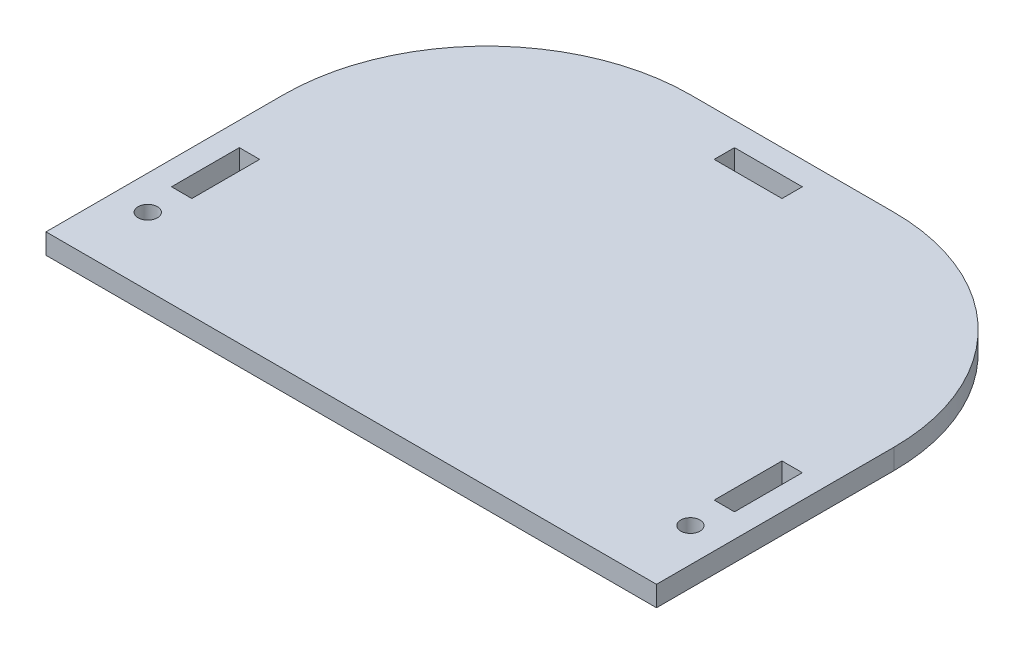
ISO-10303-21;
HEADER;
FILE_DESCRIPTION(('STEP AP214'),'2;1');
FILE_NAME('part.step','',(''),(''),'','','');
FILE_SCHEMA(('AUTOMOTIVE_DESIGN { 1 0 10303 214 1 1 1 1 }'));
ENDSEC;
DATA;
#1=APPLICATION_CONTEXT('core data for automotive mechanical design processes');
#2=APPLICATION_PROTOCOL_DEFINITION('international standard','automotive_design',2000,#1);
#3=PRODUCT_CONTEXT('',#1,'mechanical');
#4=PRODUCT('Part','Part','',(#3));
#5=PRODUCT_RELATED_PRODUCT_CATEGORY('part','',(#4));
#6=PRODUCT_DEFINITION_FORMATION('','',#4);
#7=PRODUCT_DEFINITION_CONTEXT('part definition',#1,'design');
#8=PRODUCT_DEFINITION('design','',#6,#7);
#9=PRODUCT_DEFINITION_SHAPE('','',#8);
#10=(LENGTH_UNIT() NAMED_UNIT(*) SI_UNIT(.MILLI.,.METRE.));
#11=(NAMED_UNIT(*) PLANE_ANGLE_UNIT() SI_UNIT($,.RADIAN.));
#12=(NAMED_UNIT(*) SI_UNIT($,.STERADIAN.) SOLID_ANGLE_UNIT());
#13=UNCERTAINTY_MEASURE_WITH_UNIT(LENGTH_MEASURE(1.E-05),#10,'distance_accuracy_value','');
#14=(GEOMETRIC_REPRESENTATION_CONTEXT(3) GLOBAL_UNCERTAINTY_ASSIGNED_CONTEXT((#13)) GLOBAL_UNIT_ASSIGNED_CONTEXT((#10,
#11,#12)) REPRESENTATION_CONTEXT('',''));
#15=CARTESIAN_POINT('',(0.,0.,0.));
#16=DIRECTION('',(0.,0.,1.));
#17=DIRECTION('',(1.,0.,0.));
#18=AXIS2_PLACEMENT_3D('',#15,#16,#17);
#19=CARTESIAN_POINT('',(0.,3.,0.));
#20=DIRECTION('',(0.,1.,0.));
#21=DIRECTION('',(0.,0.,1.));
#22=AXIS2_PLACEMENT_3D('',#19,#20,#21);
#23=PLANE('',#22);
#24=CARTESIAN_POINT('',(-40.,3.,-5.));
#25=DIRECTION('',(0.,1.,0.));
#26=DIRECTION('',(0.,0.,1.));
#27=AXIS2_PLACEMENT_3D('',#24,#25,#26);
#28=CIRCLE('',#27,1.425);
#29=CARTESIAN_POINT('',(-40.,3.,-3.575));
#30=VERTEX_POINT('',#29);
#31=EDGE_CURVE('E195',#30,#30,#28,.T.);
#32=ORIENTED_EDGE('',*,*,#31,.F.);
#33=EDGE_LOOP('',(#32));
#34=FACE_BOUND('',#33,.T.);
#35=DIRECTION('',(0.,0.,-1.));
#36=VECTOR('',#35,1.);
#37=CARTESIAN_POINT('',(45.,3.,-60.));
#38=LINE('',#37,#36);
#39=CARTESIAN_POINT('',(45.,3.,5.));
#40=VERTEX_POINT('',#39);
#41=CARTESIAN_POINT('',(45.,3.,-30.));
#42=VERTEX_POINT('',#41);
#43=EDGE_CURVE('E273',#40,#42,#38,.T.);
#44=ORIENTED_EDGE('',*,*,#43,.T.);
#45=CARTESIAN_POINT('',(15.,3.,-30.));
#46=DIRECTION('',(0.,1.,0.));
#47=DIRECTION('',(0.,0.,1.));
#48=AXIS2_PLACEMENT_3D('',#45,#46,#47);
#49=CIRCLE('',#48,30.);
#50=CARTESIAN_POINT('',(15.,3.,-60.));
#51=VERTEX_POINT('',#50);
#52=EDGE_CURVE('E41',#42,#51,#49,.T.);
#53=ORIENTED_EDGE('',*,*,#52,.T.);
#54=DIRECTION('',(-1.,0.,0.));
#55=VECTOR('',#54,1.);
#56=CARTESIAN_POINT('',(-45.,3.,-60.));
#57=LINE('',#56,#55);
#58=CARTESIAN_POINT('',(-15.,3.,-60.));
#59=VERTEX_POINT('',#58);
#60=EDGE_CURVE('E275',#51,#59,#57,.T.);
#61=ORIENTED_EDGE('',*,*,#60,.T.);
#62=CARTESIAN_POINT('',(-15.,3.,-30.));
#63=DIRECTION('',(0.,1.,0.));
#64=DIRECTION('',(0.,0.,1.));
#65=AXIS2_PLACEMENT_3D('',#62,#63,#64);
#66=CIRCLE('',#65,30.);
#67=CARTESIAN_POINT('',(-45.,3.,-30.));
#68=VERTEX_POINT('',#67);
#69=EDGE_CURVE('E48',#59,#68,#66,.T.);
#70=ORIENTED_EDGE('',*,*,#69,.T.);
#71=DIRECTION('',(0.,0.,1.));
#72=VECTOR('',#71,1.);
#73=CARTESIAN_POINT('',(-45.,3.,-60.));
#74=LINE('',#73,#72);
#75=CARTESIAN_POINT('',(-45.,3.,5.));
#76=VERTEX_POINT('',#75);
#77=EDGE_CURVE('E268',#68,#76,#74,.T.);
#78=ORIENTED_EDGE('',*,*,#77,.T.);
#79=DIRECTION('',(1.,0.,0.));
#80=VECTOR('',#79,1.);
#81=CARTESIAN_POINT('',(-45.,3.,5.));
#82=LINE('',#81,#80);
#83=EDGE_CURVE('E270',#76,#40,#82,.T.);
#84=ORIENTED_EDGE('',*,*,#83,.T.);
#85=EDGE_LOOP('',(#44,#53,#61,#70,#78,#84));
#86=FACE_BOUND('',#85,.T.);
#87=DIRECTION('',(1.,0.,0.));
#88=VECTOR('',#87,1.);
#89=CARTESIAN_POINT('',(-5.,3.,-53.5));
#90=LINE('',#89,#88);
#91=CARTESIAN_POINT('',(-5.,3.,-53.5));
#92=VERTEX_POINT('',#91);
#93=CARTESIAN_POINT('',(5.,3.,-53.5));
#94=VERTEX_POINT('',#93);
#95=EDGE_CURVE('E239',#92,#94,#90,.T.);
#96=ORIENTED_EDGE('',*,*,#95,.F.);
#97=DIRECTION('',(0.,0.,1.));
#98=VECTOR('',#97,1.);
#99=CARTESIAN_POINT('',(-5.,3.,-56.5));
#100=LINE('',#99,#98);
#101=CARTESIAN_POINT('',(-5.,3.,-56.5));
#102=VERTEX_POINT('',#101);
#103=EDGE_CURVE('E237',#102,#92,#100,.T.);
#104=ORIENTED_EDGE('',*,*,#103,.F.);
#105=DIRECTION('',(-1.,0.,0.));
#106=VECTOR('',#105,1.);
#107=CARTESIAN_POINT('',(-5.,3.,-56.5));
#108=LINE('',#107,#106);
#109=CARTESIAN_POINT('',(5.,3.,-56.5));
#110=VERTEX_POINT('',#109);
#111=EDGE_CURVE('E245',#110,#102,#108,.T.);
#112=ORIENTED_EDGE('',*,*,#111,.F.);
#113=DIRECTION('',(0.,0.,-1.));
#114=VECTOR('',#113,1.);
#115=CARTESIAN_POINT('',(5.,3.,-56.5));
#116=LINE('',#115,#114);
#117=EDGE_CURVE('E242',#94,#110,#116,.T.);
#118=ORIENTED_EDGE('',*,*,#117,.F.);
#119=EDGE_LOOP('',(#96,#104,#112,#118));
#120=FACE_BOUND('',#119,.T.);
#121=DIRECTION('',(1.,0.,0.));
#122=VECTOR('',#121,1.);
#123=CARTESIAN_POINT('',(-41.5,3.,-10.));
#124=LINE('',#123,#122);
#125=CARTESIAN_POINT('',(-41.5,3.,-10.));
#126=VERTEX_POINT('',#125);
#127=CARTESIAN_POINT('',(-38.5,3.,-10.));
#128=VERTEX_POINT('',#127);
#129=EDGE_CURVE('E208',#126,#128,#124,.T.);
#130=ORIENTED_EDGE('',*,*,#129,.F.);
#131=DIRECTION('',(0.,0.,1.));
#132=VECTOR('',#131,1.);
#133=CARTESIAN_POINT('',(-41.5,3.,-20.));
#134=LINE('',#133,#132);
#135=CARTESIAN_POINT('',(-41.5,3.,-20.));
#136=VERTEX_POINT('',#135);
#137=EDGE_CURVE('E206',#136,#126,#134,.T.);
#138=ORIENTED_EDGE('',*,*,#137,.F.);
#139=DIRECTION('',(-1.,0.,0.));
#140=VECTOR('',#139,1.);
#141=CARTESIAN_POINT('',(-41.5,3.,-20.));
#142=LINE('',#141,#140);
#143=CARTESIAN_POINT('',(-38.5,3.,-20.));
#144=VERTEX_POINT('',#143);
#145=EDGE_CURVE('E214',#144,#136,#142,.T.);
#146=ORIENTED_EDGE('',*,*,#145,.F.);
#147=DIRECTION('',(0.,0.,-1.));
#148=VECTOR('',#147,1.);
#149=CARTESIAN_POINT('',(-38.5,3.,-20.));
#150=LINE('',#149,#148);
#151=EDGE_CURVE('E211',#128,#144,#150,.T.);
#152=ORIENTED_EDGE('',*,*,#151,.F.);
#153=EDGE_LOOP('',(#130,#138,#146,#152));
#154=FACE_BOUND('',#153,.T.);
#155=DIRECTION('',(1.,0.,0.));
#156=VECTOR('',#155,1.);
#157=CARTESIAN_POINT('',(38.5,3.,-10.0000000000001));
#158=LINE('',#157,#156);
#159=CARTESIAN_POINT('',(38.5,3.,-10.0000000000001));
#160=VERTEX_POINT('',#159);
#161=CARTESIAN_POINT('',(41.5,3.,-10.0000000000001));
#162=VERTEX_POINT('',#161);
#163=EDGE_CURVE('E172',#160,#162,#158,.T.);
#164=ORIENTED_EDGE('',*,*,#163,.F.);
#165=DIRECTION('',(0.,0.,1.));
#166=VECTOR('',#165,1.);
#167=CARTESIAN_POINT('',(38.5,3.,-20.0000000000001));
#168=LINE('',#167,#166);
#169=CARTESIAN_POINT('',(38.5,3.,-20.0000000000001));
#170=VERTEX_POINT('',#169);
#171=EDGE_CURVE('E162',#170,#160,#168,.T.);
#172=ORIENTED_EDGE('',*,*,#171,.F.);
#173=DIRECTION('',(-1.,0.,0.));
#174=VECTOR('',#173,1.);
#175=CARTESIAN_POINT('',(38.5,3.,-20.0000000000001));
#176=LINE('',#175,#174);
#177=CARTESIAN_POINT('',(41.5,3.,-20.0000000000001));
#178=VERTEX_POINT('',#177);
#179=EDGE_CURVE('E188',#178,#170,#176,.T.);
#180=ORIENTED_EDGE('',*,*,#179,.F.);
#181=DIRECTION('',(0.,0.,-1.));
#182=VECTOR('',#181,1.);
#183=CARTESIAN_POINT('',(41.5,3.,-20.0000000000001));
#184=LINE('',#183,#182);
#185=EDGE_CURVE('E186',#162,#178,#184,.T.);
#186=ORIENTED_EDGE('',*,*,#185,.F.);
#187=EDGE_LOOP('',(#164,#172,#180,#186));
#188=FACE_BOUND('',#187,.T.);
#189=CARTESIAN_POINT('',(40.,3.,-5.));
#190=DIRECTION('',(0.,1.,0.));
#191=DIRECTION('',(0.,0.,1.));
#192=AXIS2_PLACEMENT_3D('',#189,#190,#191);
#193=CIRCLE('',#192,1.425);
#194=CARTESIAN_POINT('',(40.,3.,-3.575));
#195=VERTEX_POINT('',#194);
#196=EDGE_CURVE('E530',#195,#195,#193,.T.);
#197=ORIENTED_EDGE('',*,*,#196,.F.);
#198=EDGE_LOOP('',(#197));
#199=FACE_BOUND('',#198,.T.);
#200=ADVANCED_FACE('F33',(#34,#86,#120,#154,#188,#199),#23,.T.);
#201=CARTESIAN_POINT('',(0.,0.,0.));
#202=DIRECTION('',(0.,1.,0.));
#203=DIRECTION('',(0.,0.,1.));
#204=AXIS2_PLACEMENT_3D('',#201,#202,#203);
#205=PLANE('',#204);
#206=DIRECTION('',(0.,0.,1.));
#207=VECTOR('',#206,1.);
#208=CARTESIAN_POINT('',(-41.5,0.,-20.));
#209=LINE('',#208,#207);
#210=CARTESIAN_POINT('',(-41.5,0.,-20.));
#211=VERTEX_POINT('',#210);
#212=CARTESIAN_POINT('',(-41.5,0.,-10.));
#213=VERTEX_POINT('',#212);
#214=EDGE_CURVE('E180',#211,#213,#209,.T.);
#215=ORIENTED_EDGE('',*,*,#214,.T.);
#216=DIRECTION('',(1.,0.,0.));
#217=VECTOR('',#216,1.);
#218=CARTESIAN_POINT('',(-41.5,0.,-10.));
#219=LINE('',#218,#217);
#220=CARTESIAN_POINT('',(-38.5,0.,-10.));
#221=VERTEX_POINT('',#220);
#222=EDGE_CURVE('E219',#213,#221,#219,.T.);
#223=ORIENTED_EDGE('',*,*,#222,.T.);
#224=DIRECTION('',(0.,0.,-1.));
#225=VECTOR('',#224,1.);
#226=CARTESIAN_POINT('',(-38.5,0.,-20.));
#227=LINE('',#226,#225);
#228=CARTESIAN_POINT('',(-38.5,0.,-20.));
#229=VERTEX_POINT('',#228);
#230=EDGE_CURVE('E222',#221,#229,#227,.T.);
#231=ORIENTED_EDGE('',*,*,#230,.T.);
#232=DIRECTION('',(-1.,0.,0.));
#233=VECTOR('',#232,1.);
#234=CARTESIAN_POINT('',(-41.5,0.,-20.));
#235=LINE('',#234,#233);
#236=EDGE_CURVE('E209',#229,#211,#235,.T.);
#237=ORIENTED_EDGE('',*,*,#236,.T.);
#238=EDGE_LOOP('',(#215,#223,#231,#237));
#239=FACE_BOUND('',#238,.T.);
#240=DIRECTION('',(-1.,0.,0.));
#241=VECTOR('',#240,1.);
#242=CARTESIAN_POINT('',(-45.,0.,-60.));
#243=LINE('',#242,#241);
#244=CARTESIAN_POINT('',(15.,0.,-60.));
#245=VERTEX_POINT('',#244);
#246=CARTESIAN_POINT('',(-15.,0.,-60.));
#247=VERTEX_POINT('',#246);
#248=EDGE_CURVE('E271',#245,#247,#243,.T.);
#249=ORIENTED_EDGE('',*,*,#248,.F.);
#250=CARTESIAN_POINT('',(15.,0.,-30.));
#251=DIRECTION('',(0.,1.,0.));
#252=DIRECTION('',(0.,0.,1.));
#253=AXIS2_PLACEMENT_3D('',#250,#251,#252);
#254=CIRCLE('',#253,30.);
#255=CARTESIAN_POINT('',(45.,0.,-30.));
#256=VERTEX_POINT('',#255);
#257=EDGE_CURVE('E297',#245,#256,#254,.F.);
#258=ORIENTED_EDGE('',*,*,#257,.T.);
#259=DIRECTION('',(0.,0.,-1.));
#260=VECTOR('',#259,1.);
#261=CARTESIAN_POINT('',(45.,0.,-60.));
#262=LINE('',#261,#260);
#263=CARTESIAN_POINT('',(45.,0.,5.));
#264=VERTEX_POINT('',#263);
#265=EDGE_CURVE('E281',#264,#256,#262,.T.);
#266=ORIENTED_EDGE('',*,*,#265,.F.);
#267=DIRECTION('',(1.,0.,0.));
#268=VECTOR('',#267,1.);
#269=CARTESIAN_POINT('',(-45.,0.,5.));
#270=LINE('',#269,#268);
#271=CARTESIAN_POINT('',(-45.,0.,5.));
#272=VERTEX_POINT('',#271);
#273=EDGE_CURVE('E279',#272,#264,#270,.T.);
#274=ORIENTED_EDGE('',*,*,#273,.F.);
#275=DIRECTION('',(0.,0.,1.));
#276=VECTOR('',#275,1.);
#277=CARTESIAN_POINT('',(-45.,0.,-60.));
#278=LINE('',#277,#276);
#279=CARTESIAN_POINT('',(-45.,0.,-30.));
#280=VERTEX_POINT('',#279);
#281=EDGE_CURVE('E267',#280,#272,#278,.T.);
#282=ORIENTED_EDGE('',*,*,#281,.F.);
#283=CARTESIAN_POINT('',(-15.,0.,-30.));
#284=DIRECTION('',(0.,1.,0.));
#285=DIRECTION('',(0.,0.,1.));
#286=AXIS2_PLACEMENT_3D('',#283,#284,#285);
#287=CIRCLE('',#286,30.);
#288=EDGE_CURVE('E295',#280,#247,#287,.F.);
#289=ORIENTED_EDGE('',*,*,#288,.T.);
#290=EDGE_LOOP('',(#249,#258,#266,#274,#282,#289));
#291=FACE_BOUND('',#290,.T.);
#292=DIRECTION('',(0.,0.,1.));
#293=VECTOR('',#292,1.);
#294=CARTESIAN_POINT('',(-5.,0.,-56.5));
#295=LINE('',#294,#293);
#296=CARTESIAN_POINT('',(-5.,0.,-56.5));
#297=VERTEX_POINT('',#296);
#298=CARTESIAN_POINT('',(-5.,0.,-53.5));
#299=VERTEX_POINT('',#298);
#300=EDGE_CURVE('E236',#297,#299,#295,.T.);
#301=ORIENTED_EDGE('',*,*,#300,.T.);
#302=DIRECTION('',(1.,0.,0.));
#303=VECTOR('',#302,1.);
#304=CARTESIAN_POINT('',(-5.,0.,-53.5));
#305=LINE('',#304,#303);
#306=CARTESIAN_POINT('',(5.,0.,-53.5));
#307=VERTEX_POINT('',#306);
#308=EDGE_CURVE('E250',#299,#307,#305,.T.);
#309=ORIENTED_EDGE('',*,*,#308,.T.);
#310=DIRECTION('',(0.,0.,-1.));
#311=VECTOR('',#310,1.);
#312=CARTESIAN_POINT('',(5.,0.,-56.5));
#313=LINE('',#312,#311);
#314=CARTESIAN_POINT('',(5.,0.,-56.5));
#315=VERTEX_POINT('',#314);
#316=EDGE_CURVE('E253',#307,#315,#313,.T.);
#317=ORIENTED_EDGE('',*,*,#316,.T.);
#318=DIRECTION('',(-1.,0.,0.));
#319=VECTOR('',#318,1.);
#320=CARTESIAN_POINT('',(-5.,0.,-56.5));
#321=LINE('',#320,#319);
#322=EDGE_CURVE('E240',#315,#297,#321,.T.);
#323=ORIENTED_EDGE('',*,*,#322,.T.);
#324=EDGE_LOOP('',(#301,#309,#317,#323));
#325=FACE_BOUND('',#324,.T.);
#326=DIRECTION('',(0.,0.,1.));
#327=VECTOR('',#326,1.);
#328=CARTESIAN_POINT('',(38.5,0.,-20.0000000000001));
#329=LINE('',#328,#327);
#330=CARTESIAN_POINT('',(38.5,0.,-20.0000000000001));
#331=VERTEX_POINT('',#330);
#332=CARTESIAN_POINT('',(38.5,0.,-10.0000000000001));
#333=VERTEX_POINT('',#332);
#334=EDGE_CURVE('E193',#331,#333,#329,.T.);
#335=ORIENTED_EDGE('',*,*,#334,.T.);
#336=DIRECTION('',(1.,0.,0.));
#337=VECTOR('',#336,1.);
#338=CARTESIAN_POINT('',(38.5,0.,-10.0000000000001));
#339=LINE('',#338,#337);
#340=CARTESIAN_POINT('',(41.5,0.,-10.0000000000001));
#341=VERTEX_POINT('',#340);
#342=EDGE_CURVE('E179',#333,#341,#339,.T.);
#343=ORIENTED_EDGE('',*,*,#342,.T.);
#344=DIRECTION('',(0.,0.,-1.));
#345=VECTOR('',#344,1.);
#346=CARTESIAN_POINT('',(41.5,0.,-20.0000000000001));
#347=LINE('',#346,#345);
#348=CARTESIAN_POINT('',(41.5,0.,-20.0000000000001));
#349=VERTEX_POINT('',#348);
#350=EDGE_CURVE('E197',#341,#349,#347,.T.);
#351=ORIENTED_EDGE('',*,*,#350,.T.);
#352=DIRECTION('',(-1.,0.,0.));
#353=VECTOR('',#352,1.);
#354=CARTESIAN_POINT('',(38.5,0.,-20.0000000000001));
#355=LINE('',#354,#353);
#356=EDGE_CURVE('E173',#349,#331,#355,.T.);
#357=ORIENTED_EDGE('',*,*,#356,.T.);
#358=EDGE_LOOP('',(#335,#343,#351,#357));
#359=FACE_BOUND('',#358,.T.);
#360=CARTESIAN_POINT('',(-40.,0.,-5.));
#361=DIRECTION('',(0.,1.,0.));
#362=DIRECTION('',(0.,0.,1.));
#363=AXIS2_PLACEMENT_3D('',#360,#361,#362);
#364=CIRCLE('',#363,1.425);
#365=CARTESIAN_POINT('',(-40.,0.,-3.575));
#366=VERTEX_POINT('',#365);
#367=EDGE_CURVE('E536',#366,#366,#364,.T.);
#368=ORIENTED_EDGE('',*,*,#367,.T.);
#369=EDGE_LOOP('',(#368));
#370=FACE_BOUND('',#369,.T.);
#371=CARTESIAN_POINT('',(40.,0.,-5.));
#372=DIRECTION('',(0.,1.,0.));
#373=DIRECTION('',(0.,0.,1.));
#374=AXIS2_PLACEMENT_3D('',#371,#372,#373);
#375=CIRCLE('',#374,1.425);
#376=CARTESIAN_POINT('',(40.,0.,-3.575));
#377=VERTEX_POINT('',#376);
#378=EDGE_CURVE('E533',#377,#377,#375,.T.);
#379=ORIENTED_EDGE('',*,*,#378,.T.);
#380=EDGE_LOOP('',(#379));
#381=FACE_BOUND('',#380,.T.);
#382=ADVANCED_FACE('F312',(#239,#291,#325,#359,#370,#381),#205,.F.);
#383=CARTESIAN_POINT('',(-45.,3.,-60.));
#384=DIRECTION('',(1.,0.,0.));
#385=DIRECTION('',(0.,0.,-1.));
#386=AXIS2_PLACEMENT_3D('',#383,#384,#385);
#387=PLANE('',#386);
#388=ORIENTED_EDGE('',*,*,#77,.F.);
#389=DIRECTION('',(0.,-1.,0.));
#390=VECTOR('',#389,1.);
#391=CARTESIAN_POINT('',(-45.,3.,-30.));
#392=LINE('',#391,#390);
#393=EDGE_CURVE('E11',#68,#280,#392,.T.);
#394=ORIENTED_EDGE('',*,*,#393,.T.);
#395=ORIENTED_EDGE('',*,*,#281,.T.);
#396=DIRECTION('',(0.,-1.,0.));
#397=VECTOR('',#396,1.);
#398=CARTESIAN_POINT('',(-45.,3.,5.));
#399=LINE('',#398,#397);
#400=EDGE_CURVE('E287',#76,#272,#399,.T.);
#401=ORIENTED_EDGE('',*,*,#400,.F.);
#402=EDGE_LOOP('',(#388,#394,#395,#401));
#403=FACE_BOUND('',#402,.T.);
#404=ADVANCED_FACE('F323',(#403),#387,.F.);
#405=CARTESIAN_POINT('',(-45.,3.,5.));
#406=DIRECTION('',(0.,0.,-1.));
#407=DIRECTION('',(-1.,0.,0.));
#408=AXIS2_PLACEMENT_3D('',#405,#406,#407);
#409=PLANE('',#408);
#410=ORIENTED_EDGE('',*,*,#273,.T.);
#411=DIRECTION('',(0.,-1.,0.));
#412=VECTOR('',#411,1.);
#413=CARTESIAN_POINT('',(45.,3.,5.));
#414=LINE('',#413,#412);
#415=EDGE_CURVE('E277',#40,#264,#414,.T.);
#416=ORIENTED_EDGE('',*,*,#415,.F.);
#417=ORIENTED_EDGE('',*,*,#83,.F.);
#418=ORIENTED_EDGE('',*,*,#400,.T.);
#419=EDGE_LOOP('',(#410,#416,#417,#418));
#420=FACE_BOUND('',#419,.T.);
#421=ADVANCED_FACE('F319',(#420),#409,.F.);
#422=CARTESIAN_POINT('',(45.,3.,-60.));
#423=DIRECTION('',(-1.,0.,0.));
#424=DIRECTION('',(0.,0.,1.));
#425=AXIS2_PLACEMENT_3D('',#422,#423,#424);
#426=PLANE('',#425);
#427=ORIENTED_EDGE('',*,*,#265,.T.);
#428=DIRECTION('',(0.,-1.,0.));
#429=VECTOR('',#428,1.);
#430=CARTESIAN_POINT('',(45.,3.,-30.));
#431=LINE('',#430,#429);
#432=EDGE_CURVE('E56',#256,#42,#431,.F.);
#433=ORIENTED_EDGE('',*,*,#432,.T.);
#434=ORIENTED_EDGE('',*,*,#43,.F.);
#435=ORIENTED_EDGE('',*,*,#415,.T.);
#436=EDGE_LOOP('',(#427,#433,#434,#435));
#437=FACE_BOUND('',#436,.T.);
#438=ADVANCED_FACE('F315',(#437),#426,.F.);
#439=CARTESIAN_POINT('',(-45.,3.,-60.));
#440=DIRECTION('',(0.,0.,1.));
#441=DIRECTION('',(1.,0.,0.));
#442=AXIS2_PLACEMENT_3D('',#439,#440,#441);
#443=PLANE('',#442);
#444=ORIENTED_EDGE('',*,*,#60,.F.);
#445=DIRECTION('',(0.,-1.,0.));
#446=VECTOR('',#445,1.);
#447=CARTESIAN_POINT('',(15.,3.,-60.));
#448=LINE('',#447,#446);
#449=EDGE_CURVE('E292',#51,#245,#448,.T.);
#450=ORIENTED_EDGE('',*,*,#449,.T.);
#451=ORIENTED_EDGE('',*,*,#248,.T.);
#452=DIRECTION('',(0.,-1.,0.));
#453=VECTOR('',#452,1.);
#454=CARTESIAN_POINT('',(-15.,3.,-60.));
#455=LINE('',#454,#453);
#456=EDGE_CURVE('E290',#247,#59,#455,.F.);
#457=ORIENTED_EDGE('',*,*,#456,.T.);
#458=EDGE_LOOP('',(#444,#450,#451,#457));
#459=FACE_BOUND('',#458,.T.);
#460=ADVANCED_FACE('F306',(#459),#443,.F.);
#461=CARTESIAN_POINT('',(-5.,3.,-56.5));
#462=DIRECTION('',(1.,0.,0.));
#463=DIRECTION('',(0.,0.,-1.));
#464=AXIS2_PLACEMENT_3D('',#461,#462,#463);
#465=PLANE('',#464);
#466=ORIENTED_EDGE('',*,*,#300,.F.);
#467=DIRECTION('',(0.,-1.,0.));
#468=VECTOR('',#467,1.);
#469=CARTESIAN_POINT('',(-5.,3.,-56.5));
#470=LINE('',#469,#468);
#471=EDGE_CURVE('E247',#102,#297,#470,.T.);
#472=ORIENTED_EDGE('',*,*,#471,.F.);
#473=ORIENTED_EDGE('',*,*,#103,.T.);
#474=DIRECTION('',(0.,-1.,0.));
#475=VECTOR('',#474,1.);
#476=CARTESIAN_POINT('',(-5.,3.,-53.5));
#477=LINE('',#476,#475);
#478=EDGE_CURVE('E264',#92,#299,#477,.T.);
#479=ORIENTED_EDGE('',*,*,#478,.T.);
#480=EDGE_LOOP('',(#466,#472,#473,#479));
#481=FACE_BOUND('',#480,.T.);
#482=ADVANCED_FACE('F341',(#481),#465,.T.);
#483=CARTESIAN_POINT('',(-5.,3.,-53.5));
#484=DIRECTION('',(0.,0.,-1.));
#485=DIRECTION('',(-1.,0.,0.));
#486=AXIS2_PLACEMENT_3D('',#483,#484,#485);
#487=PLANE('',#486);
#488=ORIENTED_EDGE('',*,*,#308,.F.);
#489=ORIENTED_EDGE('',*,*,#478,.F.);
#490=ORIENTED_EDGE('',*,*,#95,.T.);
#491=DIRECTION('',(0.,-1.,0.));
#492=VECTOR('',#491,1.);
#493=CARTESIAN_POINT('',(5.,3.,-53.5));
#494=LINE('',#493,#492);
#495=EDGE_CURVE('E262',#94,#307,#494,.T.);
#496=ORIENTED_EDGE('',*,*,#495,.T.);
#497=EDGE_LOOP('',(#488,#489,#490,#496));
#498=FACE_BOUND('',#497,.T.);
#499=ADVANCED_FACE('F374',(#498),#487,.T.);
#500=CARTESIAN_POINT('',(5.,3.,-56.5));
#501=DIRECTION('',(-1.,0.,0.));
#502=DIRECTION('',(0.,0.,1.));
#503=AXIS2_PLACEMENT_3D('',#500,#501,#502);
#504=PLANE('',#503);
#505=ORIENTED_EDGE('',*,*,#316,.F.);
#506=ORIENTED_EDGE('',*,*,#495,.F.);
#507=ORIENTED_EDGE('',*,*,#117,.T.);
#508=DIRECTION('',(0.,-1.,0.));
#509=VECTOR('',#508,1.);
#510=CARTESIAN_POINT('',(5.,3.,-56.5));
#511=LINE('',#510,#509);
#512=EDGE_CURVE('E260',#110,#315,#511,.T.);
#513=ORIENTED_EDGE('',*,*,#512,.T.);
#514=EDGE_LOOP('',(#505,#506,#507,#513));
#515=FACE_BOUND('',#514,.T.);
#516=ADVANCED_FACE('F381',(#515),#504,.T.);
#517=CARTESIAN_POINT('',(-5.,3.,-56.5));
#518=DIRECTION('',(0.,0.,1.));
#519=DIRECTION('',(1.,0.,0.));
#520=AXIS2_PLACEMENT_3D('',#517,#518,#519);
#521=PLANE('',#520);
#522=ORIENTED_EDGE('',*,*,#322,.F.);
#523=ORIENTED_EDGE('',*,*,#512,.F.);
#524=ORIENTED_EDGE('',*,*,#111,.T.);
#525=ORIENTED_EDGE('',*,*,#471,.T.);
#526=EDGE_LOOP('',(#522,#523,#524,#525));
#527=FACE_BOUND('',#526,.T.);
#528=ADVANCED_FACE('F388',(#527),#521,.T.);
#529=CARTESIAN_POINT('',(-41.5,3.,-20.));
#530=DIRECTION('',(1.,0.,0.));
#531=DIRECTION('',(0.,0.,-1.));
#532=AXIS2_PLACEMENT_3D('',#529,#530,#531);
#533=PLANE('',#532);
#534=ORIENTED_EDGE('',*,*,#214,.F.);
#535=DIRECTION('',(0.,-1.,0.));
#536=VECTOR('',#535,1.);
#537=CARTESIAN_POINT('',(-41.5,3.,-20.));
#538=LINE('',#537,#536);
#539=EDGE_CURVE('E216',#136,#211,#538,.T.);
#540=ORIENTED_EDGE('',*,*,#539,.F.);
#541=ORIENTED_EDGE('',*,*,#137,.T.);
#542=DIRECTION('',(0.,-1.,0.));
#543=VECTOR('',#542,1.);
#544=CARTESIAN_POINT('',(-41.5,3.,-10.));
#545=LINE('',#544,#543);
#546=EDGE_CURVE('E233',#126,#213,#545,.T.);
#547=ORIENTED_EDGE('',*,*,#546,.T.);
#548=EDGE_LOOP('',(#534,#540,#541,#547));
#549=FACE_BOUND('',#548,.T.);
#550=ADVANCED_FACE('F396',(#549),#533,.T.);
#551=CARTESIAN_POINT('',(-41.5,3.,-10.));
#552=DIRECTION('',(0.,0.,-1.));
#553=DIRECTION('',(-1.,0.,0.));
#554=AXIS2_PLACEMENT_3D('',#551,#552,#553);
#555=PLANE('',#554);
#556=ORIENTED_EDGE('',*,*,#222,.F.);
#557=ORIENTED_EDGE('',*,*,#546,.F.);
#558=ORIENTED_EDGE('',*,*,#129,.T.);
#559=DIRECTION('',(0.,-1.,0.));
#560=VECTOR('',#559,1.);
#561=CARTESIAN_POINT('',(-38.5,3.,-10.));
#562=LINE('',#561,#560);
#563=EDGE_CURVE('E231',#128,#221,#562,.T.);
#564=ORIENTED_EDGE('',*,*,#563,.T.);
#565=EDGE_LOOP('',(#556,#557,#558,#564));
#566=FACE_BOUND('',#565,.T.);
#567=ADVANCED_FACE('F404',(#566),#555,.T.);
#568=CARTESIAN_POINT('',(-38.5,3.,-20.));
#569=DIRECTION('',(-1.,0.,0.));
#570=DIRECTION('',(0.,0.,1.));
#571=AXIS2_PLACEMENT_3D('',#568,#569,#570);
#572=PLANE('',#571);
#573=ORIENTED_EDGE('',*,*,#230,.F.);
#574=ORIENTED_EDGE('',*,*,#563,.F.);
#575=ORIENTED_EDGE('',*,*,#151,.T.);
#576=DIRECTION('',(0.,-1.,0.));
#577=VECTOR('',#576,1.);
#578=CARTESIAN_POINT('',(-38.5,3.,-20.));
#579=LINE('',#578,#577);
#580=EDGE_CURVE('E229',#144,#229,#579,.T.);
#581=ORIENTED_EDGE('',*,*,#580,.T.);
#582=EDGE_LOOP('',(#573,#574,#575,#581));
#583=FACE_BOUND('',#582,.T.);
#584=ADVANCED_FACE('F412',(#583),#572,.T.);
#585=CARTESIAN_POINT('',(-41.5,3.,-20.));
#586=DIRECTION('',(0.,0.,1.));
#587=DIRECTION('',(1.,0.,0.));
#588=AXIS2_PLACEMENT_3D('',#585,#586,#587);
#589=PLANE('',#588);
#590=ORIENTED_EDGE('',*,*,#236,.F.);
#591=ORIENTED_EDGE('',*,*,#580,.F.);
#592=ORIENTED_EDGE('',*,*,#145,.T.);
#593=ORIENTED_EDGE('',*,*,#539,.T.);
#594=EDGE_LOOP('',(#590,#591,#592,#593));
#595=FACE_BOUND('',#594,.T.);
#596=ADVANCED_FACE('F420',(#595),#589,.T.);
#597=CARTESIAN_POINT('',(38.5,3.,-20.0000000000001));
#598=DIRECTION('',(1.,0.,0.));
#599=DIRECTION('',(0.,0.,-1.));
#600=AXIS2_PLACEMENT_3D('',#597,#598,#599);
#601=PLANE('',#600);
#602=ORIENTED_EDGE('',*,*,#334,.F.);
#603=DIRECTION('',(0.,-1.,0.));
#604=VECTOR('',#603,1.);
#605=CARTESIAN_POINT('',(38.5,3.,-20.0000000000001));
#606=LINE('',#605,#604);
#607=EDGE_CURVE('E168',#170,#331,#606,.T.);
#608=ORIENTED_EDGE('',*,*,#607,.F.);
#609=ORIENTED_EDGE('',*,*,#171,.T.);
#610=DIRECTION('',(0.,-1.,0.));
#611=VECTOR('',#610,1.);
#612=CARTESIAN_POINT('',(38.5,3.,-10.0000000000001));
#613=LINE('',#612,#611);
#614=EDGE_CURVE('E165',#160,#333,#613,.T.);
#615=ORIENTED_EDGE('',*,*,#614,.T.);
#616=EDGE_LOOP('',(#602,#608,#609,#615));
#617=FACE_BOUND('',#616,.T.);
#618=ADVANCED_FACE('F164',(#617),#601,.T.);
#619=CARTESIAN_POINT('',(38.5,3.,-10.0000000000001));
#620=DIRECTION('',(0.,0.,-1.));
#621=DIRECTION('',(-1.,0.,0.));
#622=AXIS2_PLACEMENT_3D('',#619,#620,#621);
#623=PLANE('',#622);
#624=ORIENTED_EDGE('',*,*,#342,.F.);
#625=ORIENTED_EDGE('',*,*,#614,.F.);
#626=ORIENTED_EDGE('',*,*,#163,.T.);
#627=DIRECTION('',(0.,-1.,0.));
#628=VECTOR('',#627,1.);
#629=CARTESIAN_POINT('',(41.5,3.,-10.0000000000001));
#630=LINE('',#629,#628);
#631=EDGE_CURVE('E181',#162,#341,#630,.T.);
#632=ORIENTED_EDGE('',*,*,#631,.T.);
#633=EDGE_LOOP('',(#624,#625,#626,#632));
#634=FACE_BOUND('',#633,.T.);
#635=ADVANCED_FACE('F176',(#634),#623,.T.);
#636=CARTESIAN_POINT('',(41.5,3.,-20.0000000000001));
#637=DIRECTION('',(-1.,0.,0.));
#638=DIRECTION('',(0.,0.,1.));
#639=AXIS2_PLACEMENT_3D('',#636,#637,#638);
#640=PLANE('',#639);
#641=ORIENTED_EDGE('',*,*,#350,.F.);
#642=ORIENTED_EDGE('',*,*,#631,.F.);
#643=ORIENTED_EDGE('',*,*,#185,.T.);
#644=DIRECTION('',(0.,-1.,0.));
#645=VECTOR('',#644,1.);
#646=CARTESIAN_POINT('',(41.5,3.,-20.0000000000001));
#647=LINE('',#646,#645);
#648=EDGE_CURVE('E203',#178,#349,#647,.T.);
#649=ORIENTED_EDGE('',*,*,#648,.T.);
#650=EDGE_LOOP('',(#641,#642,#643,#649));
#651=FACE_BOUND('',#650,.T.);
#652=ADVANCED_FACE('F441',(#651),#640,.T.);
#653=CARTESIAN_POINT('',(38.5,3.,-20.0000000000001));
#654=DIRECTION('',(0.,0.,1.));
#655=DIRECTION('',(1.,0.,0.));
#656=AXIS2_PLACEMENT_3D('',#653,#654,#655);
#657=PLANE('',#656);
#658=ORIENTED_EDGE('',*,*,#356,.F.);
#659=ORIENTED_EDGE('',*,*,#648,.F.);
#660=ORIENTED_EDGE('',*,*,#179,.T.);
#661=ORIENTED_EDGE('',*,*,#607,.T.);
#662=EDGE_LOOP('',(#658,#659,#660,#661));
#663=FACE_BOUND('',#662,.T.);
#664=ADVANCED_FACE('F448',(#663),#657,.T.);
#665=CARTESIAN_POINT('',(-40.,3.,-5.));
#666=DIRECTION('',(0.,-1.,0.));
#667=DIRECTION('',(0.,0.,-1.));
#668=AXIS2_PLACEMENT_3D('',#665,#666,#667);
#669=CYLINDRICAL_SURFACE('',#668,1.425);
#670=ORIENTED_EDGE('',*,*,#31,.T.);
#671=EDGE_LOOP('',(#670));
#672=FACE_BOUND('',#671,.T.);
#673=ORIENTED_EDGE('',*,*,#367,.F.);
#674=EDGE_LOOP('',(#673));
#675=FACE_BOUND('',#674,.T.);
#676=ADVANCED_FACE('F456',(#672,#675),#669,.F.);
#677=CARTESIAN_POINT('',(40.,3.,-5.));
#678=DIRECTION('',(0.,-1.,0.));
#679=DIRECTION('',(0.,0.,-1.));
#680=AXIS2_PLACEMENT_3D('',#677,#678,#679);
#681=CYLINDRICAL_SURFACE('',#680,1.425);
#682=ORIENTED_EDGE('',*,*,#196,.T.);
#683=EDGE_LOOP('',(#682));
#684=FACE_BOUND('',#683,.T.);
#685=ORIENTED_EDGE('',*,*,#378,.F.);
#686=EDGE_LOOP('',(#685));
#687=FACE_BOUND('',#686,.T.);
#688=ADVANCED_FACE('F330',(#684,#687),#681,.F.);
#689=CARTESIAN_POINT('',(15.,3.,-30.));
#690=DIRECTION('',(0.,-1.,0.));
#691=DIRECTION('',(0.,0.,-1.));
#692=AXIS2_PLACEMENT_3D('',#689,#690,#691);
#693=CYLINDRICAL_SURFACE('',#692,30.);
#694=ORIENTED_EDGE('',*,*,#52,.F.);
#695=ORIENTED_EDGE('',*,*,#432,.F.);
#696=ORIENTED_EDGE('',*,*,#257,.F.);
#697=ORIENTED_EDGE('',*,*,#449,.F.);
#698=EDGE_LOOP('',(#694,#695,#696,#697));
#699=FACE_BOUND('',#698,.T.);
#700=ADVANCED_FACE('F309',(#699),#693,.T.);
#701=CARTESIAN_POINT('',(-15.,3.,-30.));
#702=DIRECTION('',(0.,-1.,0.));
#703=DIRECTION('',(0.,0.,-1.));
#704=AXIS2_PLACEMENT_3D('',#701,#702,#703);
#705=CYLINDRICAL_SURFACE('',#704,30.);
#706=ORIENTED_EDGE('',*,*,#69,.F.);
#707=ORIENTED_EDGE('',*,*,#456,.F.);
#708=ORIENTED_EDGE('',*,*,#288,.F.);
#709=ORIENTED_EDGE('',*,*,#393,.F.);
#710=EDGE_LOOP('',(#706,#707,#708,#709));
#711=FACE_BOUND('',#710,.T.);
#712=ADVANCED_FACE('F35',(#711),#705,.T.);
#713=CLOSED_SHELL('',(#200,#382,#404,#421,#438,#460,#482,#499,#516,#528,#550,#567,#584,#596,
#618,#635,#652,#664,#676,#688,#700,#712));
#714=MANIFOLD_SOLID_BREP('B2',#713);
#715=ADVANCED_BREP_SHAPE_REPRESENTATION('',(#18,#714),#14);
#716=SHAPE_DEFINITION_REPRESENTATION(#9,#715);
ENDSEC;
END-ISO-10303-21;
